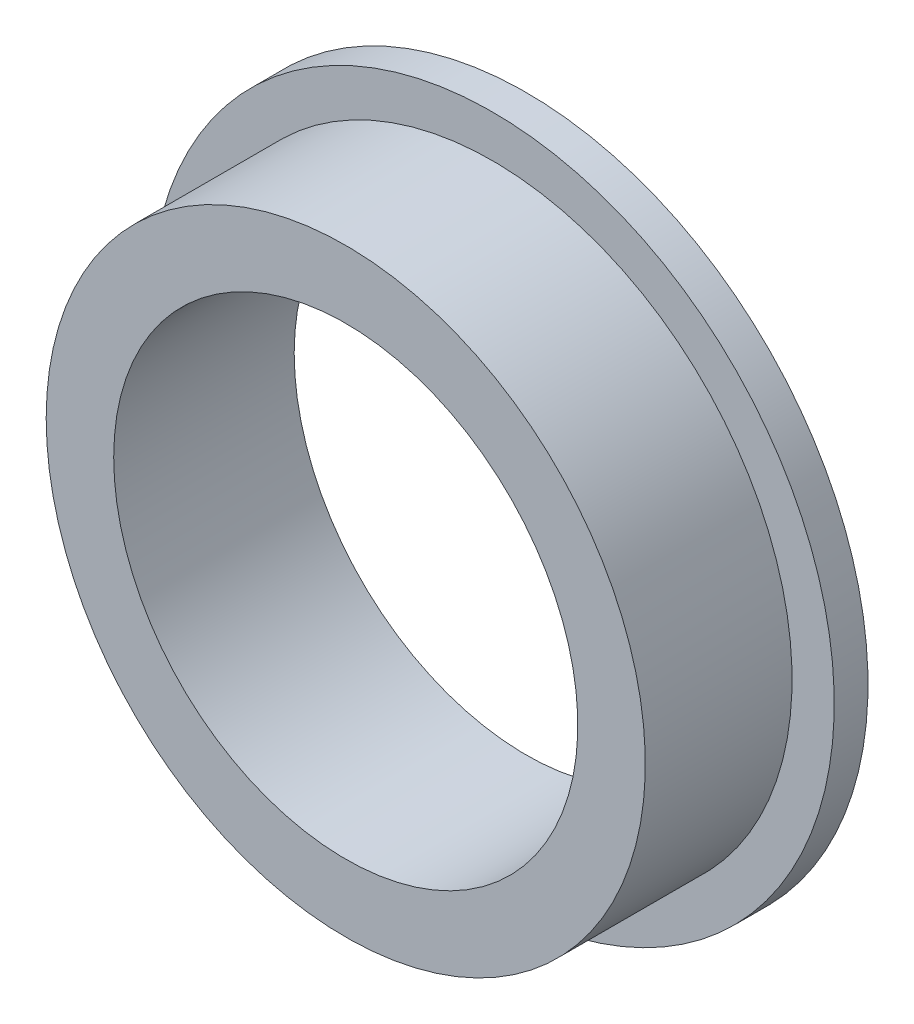
ISO-10303-21;
HEADER;
FILE_DESCRIPTION(('STEP AP214'),'2;1');
FILE_NAME('part.step','',(''),(''),'','','');
FILE_SCHEMA(('AUTOMOTIVE_DESIGN { 1 0 10303 214 1 1 1 1 }'));
ENDSEC;
DATA;
#1=APPLICATION_CONTEXT('core data for automotive mechanical design processes');
#2=APPLICATION_PROTOCOL_DEFINITION('international standard','automotive_design',2000,#1);
#3=PRODUCT_CONTEXT('',#1,'mechanical');
#4=PRODUCT('Part','Part','',(#3));
#5=PRODUCT_RELATED_PRODUCT_CATEGORY('part','',(#4));
#6=PRODUCT_DEFINITION_FORMATION('','',#4);
#7=PRODUCT_DEFINITION_CONTEXT('part definition',#1,'design');
#8=PRODUCT_DEFINITION('design','',#6,#7);
#9=PRODUCT_DEFINITION_SHAPE('','',#8);
#10=(LENGTH_UNIT() NAMED_UNIT(*) SI_UNIT(.MILLI.,.METRE.));
#11=(NAMED_UNIT(*) PLANE_ANGLE_UNIT() SI_UNIT($,.RADIAN.));
#12=(NAMED_UNIT(*) SI_UNIT($,.STERADIAN.) SOLID_ANGLE_UNIT());
#13=UNCERTAINTY_MEASURE_WITH_UNIT(LENGTH_MEASURE(1.E-05),#10,'distance_accuracy_value','');
#14=(GEOMETRIC_REPRESENTATION_CONTEXT(3) GLOBAL_UNCERTAINTY_ASSIGNED_CONTEXT((#13)) GLOBAL_UNIT_ASSIGNED_CONTEXT((#10,
#11,#12)) REPRESENTATION_CONTEXT('',''));
#15=CARTESIAN_POINT('',(0.,0.,0.));
#16=DIRECTION('',(0.,0.,1.));
#17=DIRECTION('',(1.,0.,0.));
#18=AXIS2_PLACEMENT_3D('',#15,#16,#17);
#19=CARTESIAN_POINT('',(0.,0.,-62.8426839341365));
#20=DIRECTION('',(0.,0.,-1.));
#21=DIRECTION('',(-1.,0.,0.));
#22=AXIS2_PLACEMENT_3D('',#19,#20,#21);
#23=CYLINDRICAL_SURFACE('',#22,27.5);
#24=CARTESIAN_POINT('',(0.,0.,-34.6235597986255));
#25=DIRECTION('',(0.,0.,-1.));
#26=DIRECTION('',(-1.,0.,0.));
#27=AXIS2_PLACEMENT_3D('',#24,#25,#26);
#28=CIRCLE('',#27,27.5);
#29=CARTESIAN_POINT('',(-27.5,0.,-34.6235597986255));
#30=VERTEX_POINT('',#29);
#31=EDGE_CURVE('E53',#30,#30,#28,.T.);
#32=ORIENTED_EDGE('',*,*,#31,.T.);
#33=EDGE_LOOP('',(#32));
#34=FACE_BOUND('',#33,.T.);
#35=CARTESIAN_POINT('',(0.,0.,-13.235461058826));
#36=DIRECTION('',(0.,0.,-1.));
#37=DIRECTION('',(-1.,0.,0.));
#38=AXIS2_PLACEMENT_3D('',#35,#36,#37);
#39=CIRCLE('',#38,27.5);
#40=CARTESIAN_POINT('',(-27.5,0.,-13.235461058826));
#41=VERTEX_POINT('',#40);
#42=EDGE_CURVE('E10',#41,#41,#39,.T.);
#43=ORIENTED_EDGE('',*,*,#42,.F.);
#44=EDGE_LOOP('',(#43));
#45=FACE_BOUND('',#44,.T.);
#46=ADVANCED_FACE('F31',(#34,#45),#23,.F.);
#47=CARTESIAN_POINT('',(-27.5,0.,-13.235461058826));
#48=DIRECTION('',(0.,0.,1.));
#49=DIRECTION('',(1.,0.,0.));
#50=AXIS2_PLACEMENT_3D('',#47,#48,#49);
#51=PLANE('',#50);
#52=ORIENTED_EDGE('',*,*,#42,.T.);
#53=EDGE_LOOP('',(#52));
#54=FACE_BOUND('',#53,.T.);
#55=CARTESIAN_POINT('',(0.,0.,-13.235461058826));
#56=DIRECTION('',(0.,0.,-1.));
#57=DIRECTION('',(-1.,0.,0.));
#58=AXIS2_PLACEMENT_3D('',#55,#56,#57);
#59=CIRCLE('',#58,35.5);
#60=CARTESIAN_POINT('',(-35.5,0.,-13.235461058826));
#61=VERTEX_POINT('',#60);
#62=EDGE_CURVE('E37',#61,#61,#59,.T.);
#63=ORIENTED_EDGE('',*,*,#62,.F.);
#64=EDGE_LOOP('',(#63));
#65=FACE_BOUND('',#64,.T.);
#66=ADVANCED_FACE('F71',(#54,#65),#51,.T.);
#67=CARTESIAN_POINT('',(0.,0.,-62.8426839341365));
#68=DIRECTION('',(0.,0.,-1.));
#69=DIRECTION('',(-1.,0.,0.));
#70=AXIS2_PLACEMENT_3D('',#67,#68,#69);
#71=CYLINDRICAL_SURFACE('',#70,35.5);
#72=ORIENTED_EDGE('',*,*,#62,.T.);
#73=EDGE_LOOP('',(#72));
#74=FACE_BOUND('',#73,.T.);
#75=CARTESIAN_POINT('',(0.,0.,-30.6235597986255));
#76=DIRECTION('',(0.,0.,-1.));
#77=DIRECTION('',(-1.,0.,0.));
#78=AXIS2_PLACEMENT_3D('',#75,#76,#77);
#79=CIRCLE('',#78,35.5);
#80=CARTESIAN_POINT('',(-35.5,0.,-30.6235597986255));
#81=VERTEX_POINT('',#80);
#82=EDGE_CURVE('E41',#81,#81,#79,.T.);
#83=ORIENTED_EDGE('',*,*,#82,.F.);
#84=EDGE_LOOP('',(#83));
#85=FACE_BOUND('',#84,.T.);
#86=ADVANCED_FACE('F75',(#74,#85),#71,.T.);
#87=CARTESIAN_POINT('',(-35.5,0.,-30.6235597986255));
#88=DIRECTION('',(0.,0.,1.));
#89=DIRECTION('',(1.,0.,0.));
#90=AXIS2_PLACEMENT_3D('',#87,#88,#89);
#91=PLANE('',#90);
#92=ORIENTED_EDGE('',*,*,#82,.T.);
#93=EDGE_LOOP('',(#92));
#94=FACE_BOUND('',#93,.T.);
#95=CARTESIAN_POINT('',(0.,0.,-30.6235597986255));
#96=DIRECTION('',(0.,0.,-1.));
#97=DIRECTION('',(-1.,0.,0.));
#98=AXIS2_PLACEMENT_3D('',#95,#96,#97);
#99=CIRCLE('',#98,40.5);
#100=CARTESIAN_POINT('',(-40.5,0.,-30.6235597986255));
#101=VERTEX_POINT('',#100);
#102=EDGE_CURVE('E45',#101,#101,#99,.T.);
#103=ORIENTED_EDGE('',*,*,#102,.F.);
#104=EDGE_LOOP('',(#103));
#105=FACE_BOUND('',#104,.T.);
#106=ADVANCED_FACE('F67',(#94,#105),#91,.T.);
#107=CARTESIAN_POINT('',(0.,0.,-62.8426839341365));
#108=DIRECTION('',(0.,0.,-1.));
#109=DIRECTION('',(-1.,0.,0.));
#110=AXIS2_PLACEMENT_3D('',#107,#108,#109);
#111=CYLINDRICAL_SURFACE('',#110,40.5);
#112=ORIENTED_EDGE('',*,*,#102,.T.);
#113=EDGE_LOOP('',(#112));
#114=FACE_BOUND('',#113,.T.);
#115=CARTESIAN_POINT('',(0.,0.,-34.6235597986255));
#116=DIRECTION('',(0.,0.,-1.));
#117=DIRECTION('',(-1.,0.,0.));
#118=AXIS2_PLACEMENT_3D('',#115,#116,#117);
#119=CIRCLE('',#118,40.5);
#120=CARTESIAN_POINT('',(-40.5,0.,-34.6235597986255));
#121=VERTEX_POINT('',#120);
#122=EDGE_CURVE('E50',#121,#121,#119,.T.);
#123=ORIENTED_EDGE('',*,*,#122,.F.);
#124=EDGE_LOOP('',(#123));
#125=FACE_BOUND('',#124,.T.);
#126=ADVANCED_FACE('F61',(#114,#125),#111,.T.);
#127=CARTESIAN_POINT('',(-40.5,0.,-34.6235597986255));
#128=DIRECTION('',(0.,0.,-1.));
#129=DIRECTION('',(-1.,0.,0.));
#130=AXIS2_PLACEMENT_3D('',#127,#128,#129);
#131=PLANE('',#130);
#132=ORIENTED_EDGE('',*,*,#122,.T.);
#133=EDGE_LOOP('',(#132));
#134=FACE_BOUND('',#133,.T.);
#135=ORIENTED_EDGE('',*,*,#31,.F.);
#136=EDGE_LOOP('',(#135));
#137=FACE_BOUND('',#136,.T.);
#138=ADVANCED_FACE('F59',(#134,#137),#131,.T.);
#139=CLOSED_SHELL('',(#46,#66,#86,#106,#126,#138));
#140=MANIFOLD_SOLID_BREP('B2',#139);
#141=ADVANCED_BREP_SHAPE_REPRESENTATION('',(#18,#140),#14);
#142=SHAPE_DEFINITION_REPRESENTATION(#9,#141);
ENDSEC;
END-ISO-10303-21;
